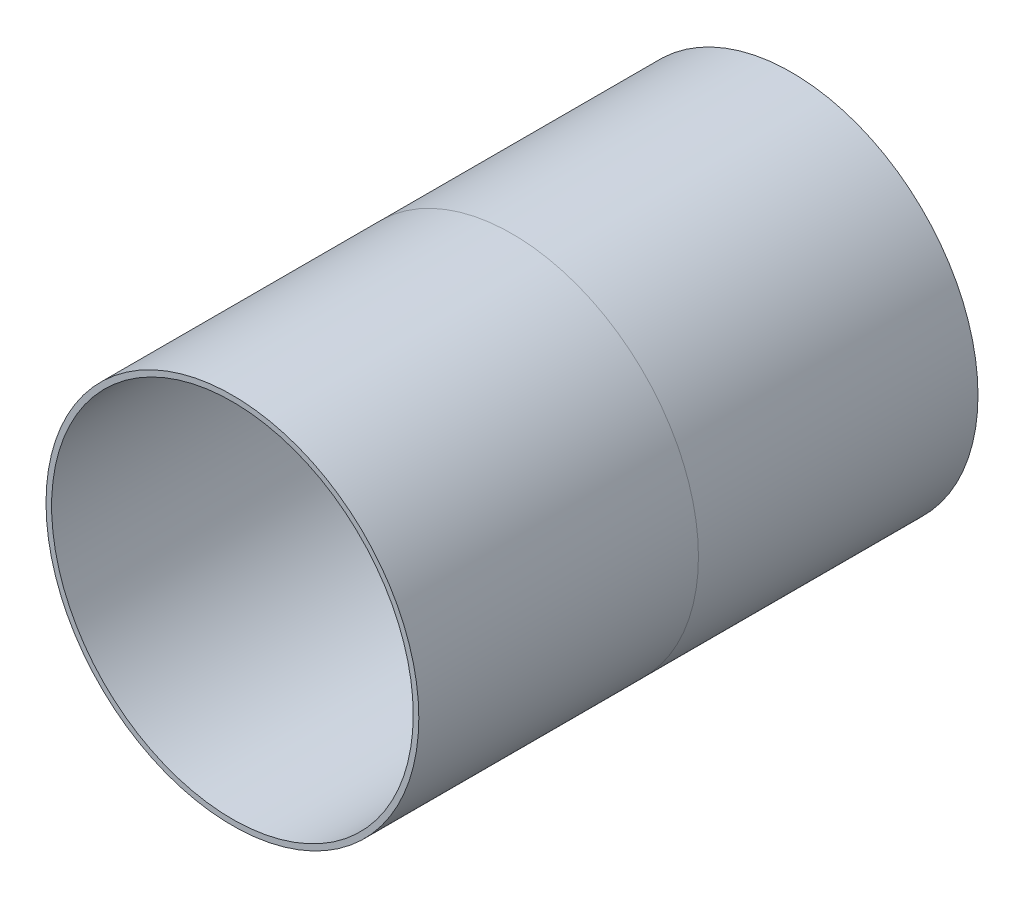
ISO-10303-21;
HEADER;
FILE_DESCRIPTION(('STEP AP214'),'2;1');
FILE_NAME('part.step','',(''),(''),'','','');
FILE_SCHEMA(('AUTOMOTIVE_DESIGN { 1 0 10303 214 1 1 1 1 }'));
ENDSEC;
DATA;
#1=APPLICATION_CONTEXT('core data for automotive mechanical design processes');
#2=APPLICATION_PROTOCOL_DEFINITION('international standard','automotive_design',2000,#1);
#3=PRODUCT_CONTEXT('',#1,'mechanical');
#4=PRODUCT('Part','Part','',(#3));
#5=PRODUCT_RELATED_PRODUCT_CATEGORY('part','',(#4));
#6=PRODUCT_DEFINITION_FORMATION('','',#4);
#7=PRODUCT_DEFINITION_CONTEXT('part definition',#1,'design');
#8=PRODUCT_DEFINITION('design','',#6,#7);
#9=PRODUCT_DEFINITION_SHAPE('','',#8);
#10=(LENGTH_UNIT() NAMED_UNIT(*) SI_UNIT(.MILLI.,.METRE.));
#11=(NAMED_UNIT(*) PLANE_ANGLE_UNIT() SI_UNIT($,.RADIAN.));
#12=(NAMED_UNIT(*) SI_UNIT($,.STERADIAN.) SOLID_ANGLE_UNIT());
#13=UNCERTAINTY_MEASURE_WITH_UNIT(LENGTH_MEASURE(1.E-05),#10,'distance_accuracy_value','');
#14=(GEOMETRIC_REPRESENTATION_CONTEXT(3) GLOBAL_UNCERTAINTY_ASSIGNED_CONTEXT((#13)) GLOBAL_UNIT_ASSIGNED_CONTEXT((#10,
#11,#12)) REPRESENTATION_CONTEXT('',''));
#15=CARTESIAN_POINT('',(0.,0.,0.));
#16=DIRECTION('',(0.,0.,1.));
#17=DIRECTION('',(1.,0.,0.));
#18=AXIS2_PLACEMENT_3D('',#15,#16,#17);
#19=CARTESIAN_POINT('',(0.,0.,0.));
#20=DIRECTION('',(0.,0.,1.));
#21=DIRECTION('',(1.,0.,0.));
#22=AXIS2_PLACEMENT_3D('',#19,#20,#21);
#23=PLANE('',#22);
#24=CARTESIAN_POINT('',(0.,0.,0.));
#25=DIRECTION('',(0.,0.,1.));
#26=DIRECTION('',(1.,0.,0.));
#27=AXIS2_PLACEMENT_3D('',#24,#25,#26);
#28=CIRCLE('',#27,76.1746);
#29=CARTESIAN_POINT('',(76.1746,0.,0.));
#30=VERTEX_POINT('',#29);
#31=EDGE_CURVE('E43',#30,#30,#28,.T.);
#32=ORIENTED_EDGE('',*,*,#31,.F.);
#33=EDGE_LOOP('',(#32));
#34=FACE_BOUND('',#33,.T.);
#35=CARTESIAN_POINT('',(0.,0.,0.));
#36=DIRECTION('',(0.,0.,1.));
#37=DIRECTION('',(1.,0.,0.));
#38=AXIS2_PLACEMENT_3D('',#35,#36,#37);
#39=CIRCLE('',#38,73.914);
#40=CARTESIAN_POINT('',(73.914,0.,0.));
#41=VERTEX_POINT('',#40);
#42=EDGE_CURVE('E50',#41,#41,#39,.T.);
#43=ORIENTED_EDGE('',*,*,#42,.T.);
#44=EDGE_LOOP('',(#43));
#45=FACE_BOUND('',#44,.T.);
#46=ADVANCED_FACE('F39',(#34,#45),#23,.F.);
#47=CARTESIAN_POINT('',(0.,0.,114.3));
#48=DIRECTION('',(0.,0.,-1.));
#49=DIRECTION('',(-1.,0.,0.));
#50=AXIS2_PLACEMENT_3D('',#47,#48,#49);
#51=CYLINDRICAL_SURFACE('',#50,76.1746);
#52=CARTESIAN_POINT('',(0.,0.,114.3));
#53=DIRECTION('',(0.,0.,1.));
#54=DIRECTION('',(1.,0.,0.));
#55=AXIS2_PLACEMENT_3D('',#52,#53,#54);
#56=CIRCLE('',#55,76.1746);
#57=CARTESIAN_POINT('',(76.1746,0.,114.3));
#58=VERTEX_POINT('',#57);
#59=EDGE_CURVE('E10',#58,#58,#56,.T.);
#60=ORIENTED_EDGE('',*,*,#59,.F.);
#61=EDGE_LOOP('',(#60));
#62=FACE_BOUND('',#61,.T.);
#63=ORIENTED_EDGE('',*,*,#31,.T.);
#64=EDGE_LOOP('',(#63));
#65=FACE_BOUND('',#64,.T.);
#66=ADVANCED_FACE('F41',(#62,#65),#51,.T.);
#67=CARTESIAN_POINT('',(0.,0.,114.3));
#68=DIRECTION('',(0.,0.,-1.));
#69=DIRECTION('',(-1.,0.,0.));
#70=AXIS2_PLACEMENT_3D('',#67,#68,#69);
#71=CYLINDRICAL_SURFACE('',#70,73.914);
#72=ORIENTED_EDGE('',*,*,#42,.F.);
#73=EDGE_LOOP('',(#72));
#74=FACE_BOUND('',#73,.T.);
#75=CARTESIAN_POINT('',(0.,0.,228.6));
#76=DIRECTION('',(0.,0.,1.));
#77=DIRECTION('',(1.,0.,0.));
#78=AXIS2_PLACEMENT_3D('',#75,#76,#77);
#79=CIRCLE('',#78,73.914);
#80=CARTESIAN_POINT('',(73.914,0.,228.6));
#81=VERTEX_POINT('',#80);
#82=EDGE_CURVE('E58',#81,#81,#79,.T.);
#83=ORIENTED_EDGE('',*,*,#82,.T.);
#84=EDGE_LOOP('',(#83));
#85=FACE_BOUND('',#84,.T.);
#86=ADVANCED_FACE('F64',(#74,#85),#71,.F.);
#87=CARTESIAN_POINT('',(0.,0.,228.6));
#88=DIRECTION('',(0.,0.,1.));
#89=DIRECTION('',(1.,0.,0.));
#90=AXIS2_PLACEMENT_3D('',#87,#88,#89);
#91=PLANE('',#90);
#92=CARTESIAN_POINT('',(0.,0.,228.6));
#93=DIRECTION('',(0.,0.,1.));
#94=DIRECTION('',(1.,0.,0.));
#95=AXIS2_PLACEMENT_3D('',#92,#93,#94);
#96=CIRCLE('',#95,76.2);
#97=CARTESIAN_POINT('',(76.2,0.,228.6));
#98=VERTEX_POINT('',#97);
#99=EDGE_CURVE('E54',#98,#98,#96,.T.);
#100=ORIENTED_EDGE('',*,*,#99,.T.);
#101=EDGE_LOOP('',(#100));
#102=FACE_BOUND('',#101,.T.);
#103=ORIENTED_EDGE('',*,*,#82,.F.);
#104=EDGE_LOOP('',(#103));
#105=FACE_BOUND('',#104,.T.);
#106=ADVANCED_FACE('F66',(#102,#105),#91,.T.);
#107=CARTESIAN_POINT('',(0.,0.,114.3));
#108=DIRECTION('',(0.,0.,1.));
#109=DIRECTION('',(1.,0.,0.));
#110=AXIS2_PLACEMENT_3D('',#107,#108,#109);
#111=PLANE('',#110);
#112=ORIENTED_EDGE('',*,*,#59,.T.);
#113=EDGE_LOOP('',(#112));
#114=FACE_BOUND('',#113,.T.);
#115=CARTESIAN_POINT('',(0.,0.,114.3));
#116=DIRECTION('',(0.,0.,1.));
#117=DIRECTION('',(1.,0.,0.));
#118=AXIS2_PLACEMENT_3D('',#115,#116,#117);
#119=CIRCLE('',#118,76.2);
#120=CARTESIAN_POINT('',(76.2,0.,114.3));
#121=VERTEX_POINT('',#120);
#122=EDGE_CURVE('E55',#121,#121,#119,.T.);
#123=ORIENTED_EDGE('',*,*,#122,.F.);
#124=EDGE_LOOP('',(#123));
#125=FACE_BOUND('',#124,.T.);
#126=ADVANCED_FACE('F68',(#114,#125),#111,.F.);
#127=CARTESIAN_POINT('',(0.,0.,228.6));
#128=DIRECTION('',(0.,0.,-1.));
#129=DIRECTION('',(-1.,0.,0.));
#130=AXIS2_PLACEMENT_3D('',#127,#128,#129);
#131=CYLINDRICAL_SURFACE('',#130,76.2);
#132=ORIENTED_EDGE('',*,*,#99,.F.);
#133=EDGE_LOOP('',(#132));
#134=FACE_BOUND('',#133,.T.);
#135=ORIENTED_EDGE('',*,*,#122,.T.);
#136=EDGE_LOOP('',(#135));
#137=FACE_BOUND('',#136,.T.);
#138=ADVANCED_FACE('F75',(#134,#137),#131,.T.);
#139=CLOSED_SHELL('',(#46,#66,#86,#106,#126,#138));
#140=MANIFOLD_SOLID_BREP('B2',#139);
#141=ADVANCED_BREP_SHAPE_REPRESENTATION('',(#18,#140),#14);
#142=SHAPE_DEFINITION_REPRESENTATION(#9,#141);
ENDSEC;
END-ISO-10303-21;
